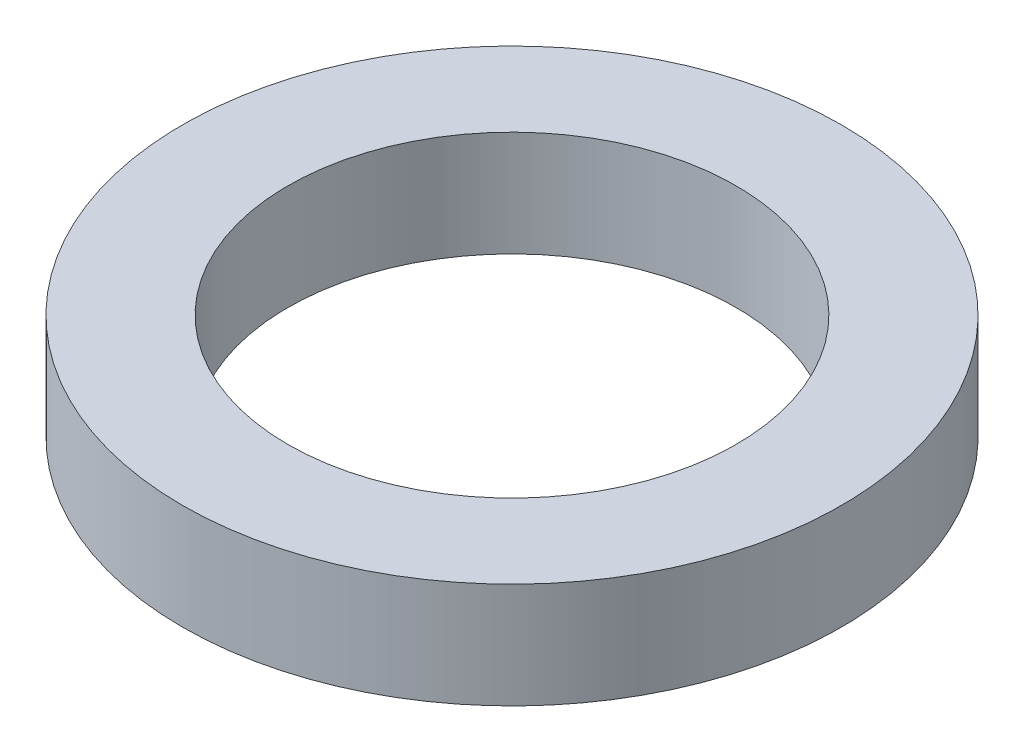
ISO-10303-21;
HEADER;
FILE_DESCRIPTION(('STEP AP214'),'2;1');
FILE_NAME('part.step','',(''),(''),'','','');
FILE_SCHEMA(('AUTOMOTIVE_DESIGN { 1 0 10303 214 1 1 1 1 }'));
ENDSEC;
DATA;
#1=APPLICATION_CONTEXT('core data for automotive mechanical design processes');
#2=APPLICATION_PROTOCOL_DEFINITION('international standard','automotive_design',2000,#1);
#3=PRODUCT_CONTEXT('',#1,'mechanical');
#4=PRODUCT('Part','Part','',(#3));
#5=PRODUCT_RELATED_PRODUCT_CATEGORY('part','',(#4));
#6=PRODUCT_DEFINITION_FORMATION('','',#4);
#7=PRODUCT_DEFINITION_CONTEXT('part definition',#1,'design');
#8=PRODUCT_DEFINITION('design','',#6,#7);
#9=PRODUCT_DEFINITION_SHAPE('','',#8);
#10=(LENGTH_UNIT() NAMED_UNIT(*) SI_UNIT(.MILLI.,.METRE.));
#11=(NAMED_UNIT(*) PLANE_ANGLE_UNIT() SI_UNIT($,.RADIAN.));
#12=(NAMED_UNIT(*) SI_UNIT($,.STERADIAN.) SOLID_ANGLE_UNIT());
#13=UNCERTAINTY_MEASURE_WITH_UNIT(LENGTH_MEASURE(1.E-05),#10,'distance_accuracy_value','');
#14=(GEOMETRIC_REPRESENTATION_CONTEXT(3) GLOBAL_UNCERTAINTY_ASSIGNED_CONTEXT((#13)) GLOBAL_UNIT_ASSIGNED_CONTEXT((#10,
#11,#12)) REPRESENTATION_CONTEXT('',''));
#15=CARTESIAN_POINT('',(0.,0.,0.));
#16=DIRECTION('',(0.,0.,1.));
#17=DIRECTION('',(1.,0.,0.));
#18=AXIS2_PLACEMENT_3D('',#15,#16,#17);
#19=CARTESIAN_POINT('',(0.,0.8,0.));
#20=DIRECTION('',(0.,1.,0.));
#21=DIRECTION('',(0.,0.,1.));
#22=AXIS2_PLACEMENT_3D('',#19,#20,#21);
#23=PLANE('',#22);
#24=CARTESIAN_POINT('',(0.,0.8,0.));
#25=DIRECTION('',(0.,1.,0.));
#26=DIRECTION('',(0.,0.,1.));
#27=AXIS2_PLACEMENT_3D('',#24,#25,#26);
#28=CIRCLE('',#27,2.5);
#29=CARTESIAN_POINT('',(0.,0.8,2.5));
#30=VERTEX_POINT('',#29);
#31=EDGE_CURVE('E10',#30,#30,#28,.T.);
#32=ORIENTED_EDGE('',*,*,#31,.T.);
#33=EDGE_LOOP('',(#32));
#34=FACE_BOUND('',#33,.T.);
#35=CARTESIAN_POINT('',(0.,0.8,0.));
#36=DIRECTION('',(0.,1.,0.));
#37=DIRECTION('',(0.,0.,1.));
#38=AXIS2_PLACEMENT_3D('',#35,#36,#37);
#39=CIRCLE('',#38,1.7);
#40=CARTESIAN_POINT('',(0.,0.8,1.7));
#41=VERTEX_POINT('',#40);
#42=EDGE_CURVE('E41',#41,#41,#39,.T.);
#43=ORIENTED_EDGE('',*,*,#42,.F.);
#44=EDGE_LOOP('',(#43));
#45=FACE_BOUND('',#44,.T.);
#46=ADVANCED_FACE('F30',(#34,#45),#23,.T.);
#47=CARTESIAN_POINT('',(0.,0.,0.));
#48=DIRECTION('',(0.,1.,0.));
#49=DIRECTION('',(0.,0.,1.));
#50=AXIS2_PLACEMENT_3D('',#47,#48,#49);
#51=PLANE('',#50);
#52=CARTESIAN_POINT('',(0.,0.,0.));
#53=DIRECTION('',(0.,1.,0.));
#54=DIRECTION('',(0.,0.,1.));
#55=AXIS2_PLACEMENT_3D('',#52,#53,#54);
#56=CIRCLE('',#55,2.5);
#57=CARTESIAN_POINT('',(0.,0.,2.5));
#58=VERTEX_POINT('',#57);
#59=EDGE_CURVE('E34',#58,#58,#56,.T.);
#60=ORIENTED_EDGE('',*,*,#59,.F.);
#61=EDGE_LOOP('',(#60));
#62=FACE_BOUND('',#61,.T.);
#63=CARTESIAN_POINT('',(0.,0.,0.));
#64=DIRECTION('',(0.,1.,0.));
#65=DIRECTION('',(0.,0.,1.));
#66=AXIS2_PLACEMENT_3D('',#63,#64,#65);
#67=CIRCLE('',#66,1.7);
#68=CARTESIAN_POINT('',(0.,0.,1.7));
#69=VERTEX_POINT('',#68);
#70=EDGE_CURVE('E43',#69,#69,#67,.T.);
#71=ORIENTED_EDGE('',*,*,#70,.T.);
#72=EDGE_LOOP('',(#71));
#73=FACE_BOUND('',#72,.T.);
#74=ADVANCED_FACE('F53',(#62,#73),#51,.F.);
#75=CARTESIAN_POINT('',(0.,0.8,0.));
#76=DIRECTION('',(0.,-1.,0.));
#77=DIRECTION('',(0.,0.,-1.));
#78=AXIS2_PLACEMENT_3D('',#75,#76,#77);
#79=CYLINDRICAL_SURFACE('',#78,2.5);
#80=ORIENTED_EDGE('',*,*,#31,.F.);
#81=EDGE_LOOP('',(#80));
#82=FACE_BOUND('',#81,.T.);
#83=ORIENTED_EDGE('',*,*,#59,.T.);
#84=EDGE_LOOP('',(#83));
#85=FACE_BOUND('',#84,.T.);
#86=ADVANCED_FACE('F32',(#82,#85),#79,.T.);
#87=CARTESIAN_POINT('',(0.,0.8,0.));
#88=DIRECTION('',(0.,-1.,0.));
#89=DIRECTION('',(0.,0.,-1.));
#90=AXIS2_PLACEMENT_3D('',#87,#88,#89);
#91=CYLINDRICAL_SURFACE('',#90,1.7);
#92=ORIENTED_EDGE('',*,*,#42,.T.);
#93=EDGE_LOOP('',(#92));
#94=FACE_BOUND('',#93,.T.);
#95=ORIENTED_EDGE('',*,*,#70,.F.);
#96=EDGE_LOOP('',(#95));
#97=FACE_BOUND('',#96,.T.);
#98=ADVANCED_FACE('F49',(#94,#97),#91,.F.);
#99=CLOSED_SHELL('',(#46,#74,#86,#98));
#100=MANIFOLD_SOLID_BREP('B2',#99);
#101=ADVANCED_BREP_SHAPE_REPRESENTATION('',(#18,#100),#14);
#102=SHAPE_DEFINITION_REPRESENTATION(#9,#101);
ENDSEC;
END-ISO-10303-21;
